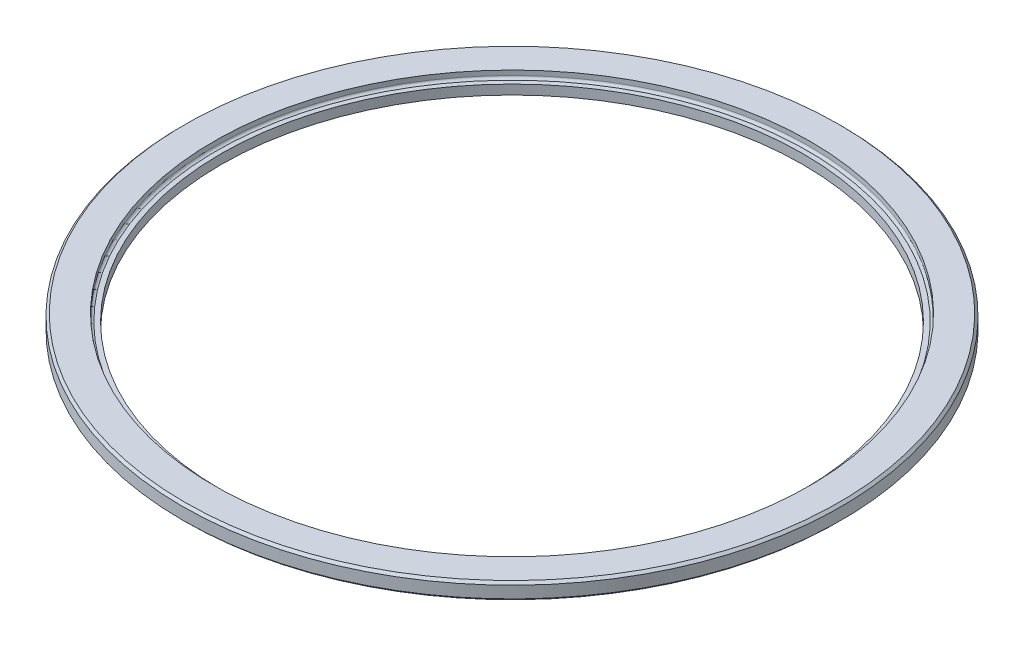
ISO-10303-21;
HEADER;
FILE_DESCRIPTION(('STEP AP214'),'2;1');
FILE_NAME('part.step','',(''),(''),'','','');
FILE_SCHEMA(('AUTOMOTIVE_DESIGN { 1 0 10303 214 1 1 1 1 }'));
ENDSEC;
DATA;
#1=APPLICATION_CONTEXT('core data for automotive mechanical design processes');
#2=APPLICATION_PROTOCOL_DEFINITION('international standard','automotive_design',2000,#1);
#3=PRODUCT_CONTEXT('',#1,'mechanical');
#4=PRODUCT('Part','Part','',(#3));
#5=PRODUCT_RELATED_PRODUCT_CATEGORY('part','',(#4));
#6=PRODUCT_DEFINITION_FORMATION('','',#4);
#7=PRODUCT_DEFINITION_CONTEXT('part definition',#1,'design');
#8=PRODUCT_DEFINITION('design','',#6,#7);
#9=PRODUCT_DEFINITION_SHAPE('','',#8);
#10=(LENGTH_UNIT() NAMED_UNIT(*) SI_UNIT(.MILLI.,.METRE.));
#11=(NAMED_UNIT(*) PLANE_ANGLE_UNIT() SI_UNIT($,.RADIAN.));
#12=(NAMED_UNIT(*) SI_UNIT($,.STERADIAN.) SOLID_ANGLE_UNIT());
#13=UNCERTAINTY_MEASURE_WITH_UNIT(LENGTH_MEASURE(1.E-05),#10,'distance_accuracy_value','');
#14=(GEOMETRIC_REPRESENTATION_CONTEXT(3) GLOBAL_UNCERTAINTY_ASSIGNED_CONTEXT((#13)) GLOBAL_UNIT_ASSIGNED_CONTEXT((#10,
#11,#12)) REPRESENTATION_CONTEXT('',''));
#15=CARTESIAN_POINT('',(0.,0.,0.));
#16=DIRECTION('',(0.,0.,1.));
#17=DIRECTION('',(1.,0.,0.));
#18=AXIS2_PLACEMENT_3D('',#15,#16,#17);
#19=CARTESIAN_POINT('',(35.2425,0.,0.));
#20=DIRECTION('',(0.,-1.,0.));
#21=DIRECTION('',(0.,0.,-1.));
#22=AXIS2_PLACEMENT_3D('',#19,#20,#21);
#23=PLANE('',#22);
#24=CARTESIAN_POINT('',(0.,0.,0.));
#25=DIRECTION('',(0.,-1.,0.));
#26=DIRECTION('',(0.,0.,-1.));
#27=AXIS2_PLACEMENT_3D('',#24,#25,#26);
#28=CIRCLE('',#27,34.9885);
#29=CARTESIAN_POINT('',(0.,0.,-34.9885));
#30=VERTEX_POINT('',#29);
#31=EDGE_CURVE('E55',#30,#30,#28,.T.);
#32=ORIENTED_EDGE('',*,*,#31,.T.);
#33=EDGE_LOOP('',(#32));
#34=FACE_BOUND('',#33,.T.);
#35=CARTESIAN_POINT('',(0.,0.,0.));
#36=DIRECTION('',(0.,-1.,0.));
#37=DIRECTION('',(0.,0.,-1.));
#38=AXIS2_PLACEMENT_3D('',#35,#36,#37);
#39=CIRCLE('',#38,31.115);
#40=CARTESIAN_POINT('',(0.,0.,-31.115));
#41=VERTEX_POINT('',#40);
#42=EDGE_CURVE('E58',#41,#41,#39,.T.);
#43=ORIENTED_EDGE('',*,*,#42,.F.);
#44=EDGE_LOOP('',(#43));
#45=FACE_BOUND('',#44,.T.);
#46=ADVANCED_FACE('F32',(#34,#45),#23,.T.);
#47=CARTESIAN_POINT('',(0.,0.,0.));
#48=DIRECTION('',(0.,-1.,0.));
#49=DIRECTION('',(0.,0.,-1.));
#50=AXIS2_PLACEMENT_3D('',#47,#48,#49);
#51=CYLINDRICAL_SURFACE('',#50,31.115);
#52=ORIENTED_EDGE('',*,*,#42,.T.);
#53=EDGE_LOOP('',(#52));
#54=FACE_BOUND('',#53,.T.);
#55=CARTESIAN_POINT('',(0.,1.016,0.));
#56=DIRECTION('',(0.,-1.,0.));
#57=DIRECTION('',(0.,0.,-1.));
#58=AXIS2_PLACEMENT_3D('',#55,#56,#57);
#59=CIRCLE('',#58,31.115);
#60=CARTESIAN_POINT('',(0.,1.016,-31.115));
#61=VERTEX_POINT('',#60);
#62=EDGE_CURVE('E61',#61,#61,#59,.T.);
#63=ORIENTED_EDGE('',*,*,#62,.F.);
#64=EDGE_LOOP('',(#63));
#65=FACE_BOUND('',#64,.T.);
#66=ADVANCED_FACE('F81',(#54,#65),#51,.F.);
#67=CARTESIAN_POINT('',(31.115,1.016,0.));
#68=DIRECTION('',(0.,1.,0.));
#69=DIRECTION('',(0.,0.,1.));
#70=AXIS2_PLACEMENT_3D('',#67,#68,#69);
#71=PLANE('',#70);
#72=CARTESIAN_POINT('',(0.,1.016,0.));
#73=DIRECTION('',(0.,1.,0.));
#74=DIRECTION('',(0.,0.,1.));
#75=AXIS2_PLACEMENT_3D('',#72,#73,#74);
#76=CIRCLE('',#75,31.623);
#77=CARTESIAN_POINT('',(0.,1.016,31.623));
#78=VERTEX_POINT('',#77);
#79=EDGE_CURVE('E10',#78,#78,#76,.T.);
#80=ORIENTED_EDGE('',*,*,#79,.T.);
#81=EDGE_LOOP('',(#80));
#82=FACE_BOUND('',#81,.T.);
#83=ORIENTED_EDGE('',*,*,#62,.T.);
#84=EDGE_LOOP('',(#83));
#85=FACE_BOUND('',#84,.T.);
#86=ADVANCED_FACE('F72',(#82,#85),#71,.T.);
#87=CARTESIAN_POINT('',(0.,0.,0.));
#88=DIRECTION('',(0.,-1.,0.));
#89=DIRECTION('',(0.,0.,-1.));
#90=AXIS2_PLACEMENT_3D('',#87,#88,#89);
#91=CYLINDRICAL_SURFACE('',#90,31.877);
#92=CARTESIAN_POINT('',(0.,1.27,0.));
#93=DIRECTION('',(0.,1.,0.));
#94=DIRECTION('',(0.,0.,1.));
#95=AXIS2_PLACEMENT_3D('',#92,#93,#94);
#96=CIRCLE('',#95,31.877);
#97=CARTESIAN_POINT('',(0.,1.27,31.877));
#98=VERTEX_POINT('',#97);
#99=EDGE_CURVE('E39',#98,#98,#96,.F.);
#100=ORIENTED_EDGE('',*,*,#99,.T.);
#101=EDGE_LOOP('',(#100));
#102=FACE_BOUND('',#101,.T.);
#103=CARTESIAN_POINT('',(0.,1.778,0.));
#104=DIRECTION('',(0.,-1.,0.));
#105=DIRECTION('',(0.,0.,-1.));
#106=AXIS2_PLACEMENT_3D('',#103,#104,#105);
#107=CIRCLE('',#106,31.877);
#108=CARTESIAN_POINT('',(0.,1.778,-31.877));
#109=VERTEX_POINT('',#108);
#110=EDGE_CURVE('E64',#109,#109,#107,.T.);
#111=ORIENTED_EDGE('',*,*,#110,.F.);
#112=EDGE_LOOP('',(#111));
#113=FACE_BOUND('',#112,.T.);
#114=ADVANCED_FACE('F70',(#102,#113),#91,.F.);
#115=CARTESIAN_POINT('',(31.877,1.778,0.));
#116=DIRECTION('',(0.,1.,0.));
#117=DIRECTION('',(0.,0.,1.));
#118=AXIS2_PLACEMENT_3D('',#115,#116,#117);
#119=PLANE('',#118);
#120=CARTESIAN_POINT('',(0.,1.778,0.));
#121=DIRECTION('',(0.,1.,0.));
#122=DIRECTION('',(0.,0.,1.));
#123=AXIS2_PLACEMENT_3D('',#120,#121,#122);
#124=CIRCLE('',#123,34.9885);
#125=CARTESIAN_POINT('',(0.,1.778,34.9885));
#126=VERTEX_POINT('',#125);
#127=EDGE_CURVE('E43',#126,#126,#124,.T.);
#128=ORIENTED_EDGE('',*,*,#127,.T.);
#129=EDGE_LOOP('',(#128));
#130=FACE_BOUND('',#129,.T.);
#131=ORIENTED_EDGE('',*,*,#110,.T.);
#132=EDGE_LOOP('',(#131));
#133=FACE_BOUND('',#132,.T.);
#134=ADVANCED_FACE('F68',(#130,#133),#119,.T.);
#135=CARTESIAN_POINT('',(0.,0.,0.));
#136=DIRECTION('',(0.,-1.,0.));
#137=DIRECTION('',(0.,0.,-1.));
#138=AXIS2_PLACEMENT_3D('',#135,#136,#137);
#139=CYLINDRICAL_SURFACE('',#138,35.2425);
#140=CARTESIAN_POINT('',(0.,0.253999999999965,0.));
#141=DIRECTION('',(0.,-1.,0.));
#142=DIRECTION('',(0.,0.,-1.));
#143=AXIS2_PLACEMENT_3D('',#140,#141,#142);
#144=CIRCLE('',#143,35.2425);
#145=CARTESIAN_POINT('',(0.,0.253999999999965,-35.2425));
#146=VERTEX_POINT('',#145);
#147=EDGE_CURVE('E47',#146,#146,#144,.F.);
#148=ORIENTED_EDGE('',*,*,#147,.T.);
#149=EDGE_LOOP('',(#148));
#150=FACE_BOUND('',#149,.T.);
#151=CARTESIAN_POINT('',(0.,1.52399999999999,0.));
#152=DIRECTION('',(0.,1.,0.));
#153=DIRECTION('',(0.,0.,1.));
#154=AXIS2_PLACEMENT_3D('',#151,#152,#153);
#155=CIRCLE('',#154,35.2425);
#156=CARTESIAN_POINT('',(0.,1.52399999999999,35.2425));
#157=VERTEX_POINT('',#156);
#158=EDGE_CURVE('E52',#157,#157,#155,.F.);
#159=ORIENTED_EDGE('',*,*,#158,.T.);
#160=EDGE_LOOP('',(#159));
#161=FACE_BOUND('',#160,.T.);
#162=ADVANCED_FACE('F78',(#150,#161),#139,.T.);
#163=CARTESIAN_POINT('',(0.,0.,0.));
#164=DIRECTION('',(0.,1.,0.));
#165=DIRECTION('',(0.,0.,1.));
#166=AXIS2_PLACEMENT_3D('',#163,#164,#165);
#167=CONICAL_SURFACE('',#166,34.9885,0.785398163397435);
#168=ORIENTED_EDGE('',*,*,#147,.F.);
#169=EDGE_LOOP('',(#168));
#170=FACE_BOUND('',#169,.T.);
#171=ORIENTED_EDGE('',*,*,#31,.F.);
#172=EDGE_LOOP('',(#171));
#173=FACE_BOUND('',#172,.T.);
#174=ADVANCED_FACE('F93',(#170,#173),#167,.T.);
#175=CARTESIAN_POINT('',(0.,1.52399999999999,0.));
#176=DIRECTION('',(0.,-1.,0.));
#177=DIRECTION('',(0.,0.,-1.));
#178=AXIS2_PLACEMENT_3D('',#175,#176,#177);
#179=CONICAL_SURFACE('',#178,35.2425,0.785398163397435);
#180=ORIENTED_EDGE('',*,*,#127,.F.);
#181=EDGE_LOOP('',(#180));
#182=FACE_BOUND('',#181,.T.);
#183=ORIENTED_EDGE('',*,*,#158,.F.);
#184=EDGE_LOOP('',(#183));
#185=FACE_BOUND('',#184,.T.);
#186=ADVANCED_FACE('F95',(#182,#185),#179,.T.);
#187=CARTESIAN_POINT('',(0.,1.27,0.));
#188=DIRECTION('',(0.,1.,0.));
#189=DIRECTION('',(0.,0.,1.));
#190=AXIS2_PLACEMENT_3D('',#187,#188,#189);
#191=TOROIDAL_SURFACE('',#190,31.623,0.254);
#192=ORIENTED_EDGE('',*,*,#79,.F.);
#193=EDGE_LOOP('',(#192));
#194=FACE_BOUND('',#193,.T.);
#195=ORIENTED_EDGE('',*,*,#99,.F.);
#196=EDGE_LOOP('',(#195));
#197=FACE_BOUND('',#196,.T.);
#198=ADVANCED_FACE('F34',(#194,#197),#191,.F.);
#199=CLOSED_SHELL('',(#46,#66,#86,#114,#134,#162,#174,#186,#198));
#200=MANIFOLD_SOLID_BREP('B2',#199);
#201=ADVANCED_BREP_SHAPE_REPRESENTATION('',(#18,#200),#14);
#202=SHAPE_DEFINITION_REPRESENTATION(#9,#201);
ENDSEC;
END-ISO-10303-21;
